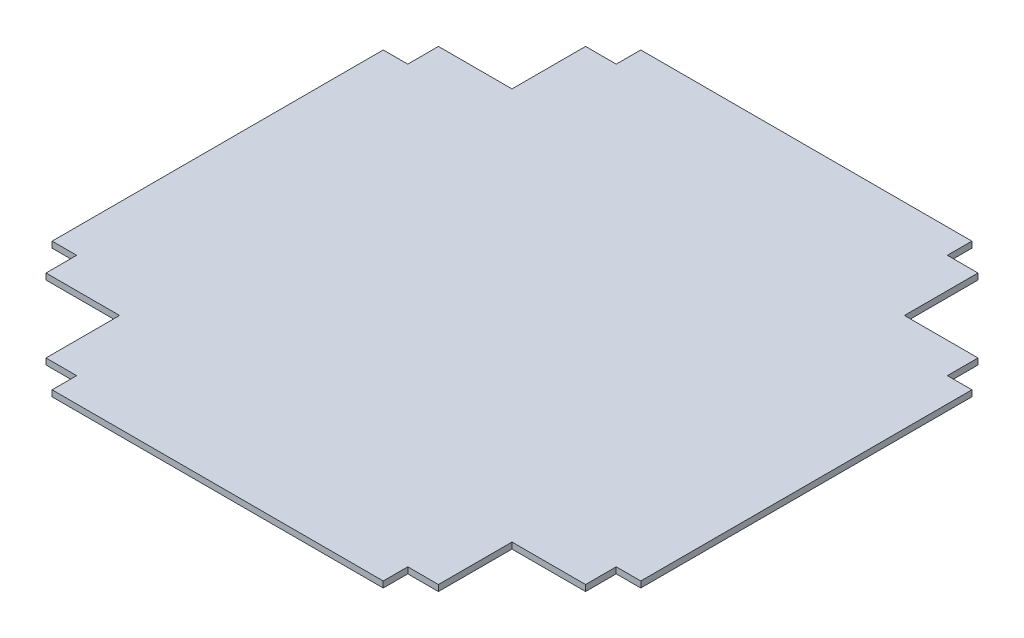
ISO-10303-21;
HEADER;
FILE_DESCRIPTION(('STEP AP214'),'2;1');
FILE_NAME('part.step','',(''),(''),'','','');
FILE_SCHEMA(('AUTOMOTIVE_DESIGN { 1 0 10303 214 1 1 1 1 }'));
ENDSEC;
DATA;
#1=APPLICATION_CONTEXT('core data for automotive mechanical design processes');
#2=APPLICATION_PROTOCOL_DEFINITION('international standard','automotive_design',2000,#1);
#3=PRODUCT_CONTEXT('',#1,'mechanical');
#4=PRODUCT('Part','Part','',(#3));
#5=PRODUCT_RELATED_PRODUCT_CATEGORY('part','',(#4));
#6=PRODUCT_DEFINITION_FORMATION('','',#4);
#7=PRODUCT_DEFINITION_CONTEXT('part definition',#1,'design');
#8=PRODUCT_DEFINITION('design','',#6,#7);
#9=PRODUCT_DEFINITION_SHAPE('','',#8);
#10=(LENGTH_UNIT() NAMED_UNIT(*) SI_UNIT(.MILLI.,.METRE.));
#11=(NAMED_UNIT(*) PLANE_ANGLE_UNIT() SI_UNIT($,.RADIAN.));
#12=(NAMED_UNIT(*) SI_UNIT($,.STERADIAN.) SOLID_ANGLE_UNIT());
#13=UNCERTAINTY_MEASURE_WITH_UNIT(LENGTH_MEASURE(1.E-05),#10,'distance_accuracy_value','');
#14=(GEOMETRIC_REPRESENTATION_CONTEXT(3) GLOBAL_UNCERTAINTY_ASSIGNED_CONTEXT((#13)) GLOBAL_UNIT_ASSIGNED_CONTEXT((#10,
#11,#12)) REPRESENTATION_CONTEXT('',''));
#15=CARTESIAN_POINT('',(0.,0.,0.));
#16=DIRECTION('',(0.,0.,1.));
#17=DIRECTION('',(1.,0.,0.));
#18=AXIS2_PLACEMENT_3D('',#15,#16,#17);
#19=CARTESIAN_POINT('',(0.,6.35,0.));
#20=DIRECTION('',(1.,0.,0.));
#21=DIRECTION('',(0.,0.,-1.));
#22=AXIS2_PLACEMENT_3D('',#19,#20,#21);
#23=PLANE('',#22);
#24=DIRECTION('',(0.,0.,1.));
#25=VECTOR('',#24,1.);
#26=CARTESIAN_POINT('',(0.,6.35,0.));
#27=LINE('',#26,#25);
#28=CARTESIAN_POINT('',(-1.11022302462516E-13,6.35,-476.25));
#29=VERTEX_POINT('',#28);
#30=CARTESIAN_POINT('',(-1.11022302462516E-13,6.35,-133.35));
#31=VERTEX_POINT('',#30);
#32=EDGE_CURVE('E265',#29,#31,#27,.T.);
#33=ORIENTED_EDGE('',*,*,#32,.F.);
#34=DIRECTION('',(0.,1.,0.));
#35=VECTOR('',#34,1.);
#36=CARTESIAN_POINT('',(-1.11022302462516E-13,0.,-476.25));
#37=LINE('',#36,#35);
#38=CARTESIAN_POINT('',(-1.11022302462516E-13,0.,-476.25));
#39=VERTEX_POINT('',#38);
#40=EDGE_CURVE('E248',#39,#29,#37,.T.);
#41=ORIENTED_EDGE('',*,*,#40,.F.);
#42=DIRECTION('',(0.,0.,1.));
#43=VECTOR('',#42,1.);
#44=CARTESIAN_POINT('',(0.,0.,0.));
#45=LINE('',#44,#43);
#46=CARTESIAN_POINT('',(-1.11022302462516E-13,0.,-133.35));
#47=VERTEX_POINT('',#46);
#48=EDGE_CURVE('E241',#39,#47,#45,.T.);
#49=ORIENTED_EDGE('',*,*,#48,.T.);
#50=DIRECTION('',(0.,1.,0.));
#51=VECTOR('',#50,1.);
#52=CARTESIAN_POINT('',(-1.11022302462516E-13,0.,-133.35));
#53=LINE('',#52,#51);
#54=EDGE_CURVE('E222',#47,#31,#53,.T.);
#55=ORIENTED_EDGE('',*,*,#54,.T.);
#56=EDGE_LOOP('',(#33,#41,#49,#55));
#57=FACE_BOUND('',#56,.T.);
#58=ADVANCED_FACE('F36',(#57),#23,.F.);
#59=CARTESIAN_POINT('',(0.,6.35,0.));
#60=DIRECTION('',(0.,0.,-1.));
#61=DIRECTION('',(-1.,0.,0.));
#62=AXIS2_PLACEMENT_3D('',#59,#60,#61);
#63=PLANE('',#62);
#64=DIRECTION('',(1.,0.,0.));
#65=VECTOR('',#64,1.);
#66=CARTESIAN_POINT('',(0.,6.35,0.));
#67=LINE('',#66,#65);
#68=CARTESIAN_POINT('',(133.35,6.35,0.));
#69=VERTEX_POINT('',#68);
#70=CARTESIAN_POINT('',(476.25,6.35,0.));
#71=VERTEX_POINT('',#70);
#72=EDGE_CURVE('E270',#69,#71,#67,.T.);
#73=ORIENTED_EDGE('',*,*,#72,.F.);
#74=DIRECTION('',(0.,1.,0.));
#75=VECTOR('',#74,1.);
#76=CARTESIAN_POINT('',(133.35,0.,0.));
#77=LINE('',#76,#75);
#78=CARTESIAN_POINT('',(133.35,0.,0.));
#79=VERTEX_POINT('',#78);
#80=EDGE_CURVE('E233',#79,#69,#77,.T.);
#81=ORIENTED_EDGE('',*,*,#80,.F.);
#82=DIRECTION('',(1.,0.,0.));
#83=VECTOR('',#82,1.);
#84=CARTESIAN_POINT('',(0.,0.,0.));
#85=LINE('',#84,#83);
#86=CARTESIAN_POINT('',(476.25,0.,0.));
#87=VERTEX_POINT('',#86);
#88=EDGE_CURVE('E249',#79,#87,#85,.T.);
#89=ORIENTED_EDGE('',*,*,#88,.T.);
#90=DIRECTION('',(0.,1.,0.));
#91=VECTOR('',#90,1.);
#92=CARTESIAN_POINT('',(476.25,0.,0.));
#93=LINE('',#92,#91);
#94=EDGE_CURVE('E250',#87,#71,#93,.T.);
#95=ORIENTED_EDGE('',*,*,#94,.T.);
#96=EDGE_LOOP('',(#73,#81,#89,#95));
#97=FACE_BOUND('',#96,.T.);
#98=ADVANCED_FACE('F466',(#97),#63,.F.);
#99=CARTESIAN_POINT('',(609.6,6.35,0.));
#100=DIRECTION('',(-1.,0.,0.));
#101=DIRECTION('',(0.,0.,1.));
#102=AXIS2_PLACEMENT_3D('',#99,#100,#101);
#103=PLANE('',#102);
#104=DIRECTION('',(0.,0.,-1.));
#105=VECTOR('',#104,1.);
#106=CARTESIAN_POINT('',(609.6,0.,0.));
#107=LINE('',#106,#105);
#108=CARTESIAN_POINT('',(609.6,0.,-133.35));
#109=VERTEX_POINT('',#108);
#110=CARTESIAN_POINT('',(609.6,0.,-476.25));
#111=VERTEX_POINT('',#110);
#112=EDGE_CURVE('E253',#109,#111,#107,.T.);
#113=ORIENTED_EDGE('',*,*,#112,.T.);
#114=DIRECTION('',(0.,1.,0.));
#115=VECTOR('',#114,1.);
#116=CARTESIAN_POINT('',(609.6,0.,-476.25));
#117=LINE('',#116,#115);
#118=CARTESIAN_POINT('',(609.6,6.35,-476.25));
#119=VERTEX_POINT('',#118);
#120=EDGE_CURVE('E290',#111,#119,#117,.T.);
#121=ORIENTED_EDGE('',*,*,#120,.T.);
#122=DIRECTION('',(0.,0.,-1.));
#123=VECTOR('',#122,1.);
#124=CARTESIAN_POINT('',(609.6,6.35,0.));
#125=LINE('',#124,#123);
#126=CARTESIAN_POINT('',(609.6,6.35,-133.35));
#127=VERTEX_POINT('',#126);
#128=EDGE_CURVE('E44',#127,#119,#125,.T.);
#129=ORIENTED_EDGE('',*,*,#128,.F.);
#130=DIRECTION('',(0.,1.,0.));
#131=VECTOR('',#130,1.);
#132=CARTESIAN_POINT('',(609.6,0.,-133.35));
#133=LINE('',#132,#131);
#134=EDGE_CURVE('E277',#109,#127,#133,.T.);
#135=ORIENTED_EDGE('',*,*,#134,.F.);
#136=EDGE_LOOP('',(#113,#121,#129,#135));
#137=FACE_BOUND('',#136,.T.);
#138=ADVANCED_FACE('F289',(#137),#103,.F.);
#139=CARTESIAN_POINT('',(0.,6.35,-609.6));
#140=DIRECTION('',(0.,0.,1.));
#141=DIRECTION('',(1.,0.,0.));
#142=AXIS2_PLACEMENT_3D('',#139,#140,#141);
#143=PLANE('',#142);
#144=DIRECTION('',(-1.,0.,0.));
#145=VECTOR('',#144,1.);
#146=CARTESIAN_POINT('',(0.,6.35,-609.6));
#147=LINE('',#146,#145);
#148=CARTESIAN_POINT('',(476.25,6.35,-609.6));
#149=VERTEX_POINT('',#148);
#150=CARTESIAN_POINT('',(133.35,6.35,-609.6));
#151=VERTEX_POINT('',#150);
#152=EDGE_CURVE('E11',#149,#151,#147,.T.);
#153=ORIENTED_EDGE('',*,*,#152,.F.);
#154=DIRECTION('',(0.,1.,0.));
#155=VECTOR('',#154,1.);
#156=CARTESIAN_POINT('',(476.25,0.,-609.6));
#157=LINE('',#156,#155);
#158=CARTESIAN_POINT('',(476.25,0.,-609.6));
#159=VERTEX_POINT('',#158);
#160=EDGE_CURVE('E293',#159,#149,#157,.T.);
#161=ORIENTED_EDGE('',*,*,#160,.F.);
#162=DIRECTION('',(-1.,0.,0.));
#163=VECTOR('',#162,1.);
#164=CARTESIAN_POINT('',(0.,0.,-609.6));
#165=LINE('',#164,#163);
#166=CARTESIAN_POINT('',(133.35,0.,-609.6));
#167=VERTEX_POINT('',#166);
#168=EDGE_CURVE('E39',#159,#167,#165,.T.);
#169=ORIENTED_EDGE('',*,*,#168,.T.);
#170=DIRECTION('',(0.,1.,0.));
#171=VECTOR('',#170,1.);
#172=CARTESIAN_POINT('',(133.35,0.,-609.6));
#173=LINE('',#172,#171);
#174=EDGE_CURVE('E401',#167,#151,#173,.T.);
#175=ORIENTED_EDGE('',*,*,#174,.T.);
#176=EDGE_LOOP('',(#153,#161,#169,#175));
#177=FACE_BOUND('',#176,.T.);
#178=ADVANCED_FACE('F400',(#177),#143,.F.);
#179=CARTESIAN_POINT('',(0.,6.35,0.));
#180=DIRECTION('',(0.,-1.,0.));
#181=DIRECTION('',(0.,0.,-1.));
#182=AXIS2_PLACEMENT_3D('',#179,#180,#181);
#183=PLANE('',#182);
#184=ORIENTED_EDGE('',*,*,#128,.T.);
#185=DIRECTION('',(1.,0.,0.));
#186=VECTOR('',#185,1.);
#187=CARTESIAN_POINT('',(584.2,6.35,-476.25));
#188=LINE('',#187,#186);
#189=CARTESIAN_POINT('',(584.2,6.35,-476.25));
#190=VERTEX_POINT('',#189);
#191=EDGE_CURVE('E285',#190,#119,#188,.T.);
#192=ORIENTED_EDGE('',*,*,#191,.F.);
#193=DIRECTION('',(0.,0.,1.));
#194=VECTOR('',#193,1.);
#195=CARTESIAN_POINT('',(584.2,6.35,-508.));
#196=LINE('',#195,#194);
#197=CARTESIAN_POINT('',(584.2,6.35,-508.));
#198=VERTEX_POINT('',#197);
#199=EDGE_CURVE('E352',#198,#190,#196,.T.);
#200=ORIENTED_EDGE('',*,*,#199,.F.);
#201=DIRECTION('',(1.,0.,0.));
#202=VECTOR('',#201,1.);
#203=CARTESIAN_POINT('',(508.,6.35,-508.));
#204=LINE('',#203,#202);
#205=CARTESIAN_POINT('',(508.,6.35,-508.));
#206=VERTEX_POINT('',#205);
#207=EDGE_CURVE('E357',#206,#198,#204,.T.);
#208=ORIENTED_EDGE('',*,*,#207,.F.);
#209=DIRECTION('',(0.,0.,1.));
#210=VECTOR('',#209,1.);
#211=CARTESIAN_POINT('',(508.,6.35,-584.2));
#212=LINE('',#211,#210);
#213=CARTESIAN_POINT('',(508.,6.35,-584.2));
#214=VERTEX_POINT('',#213);
#215=EDGE_CURVE('E374',#214,#206,#212,.T.);
#216=ORIENTED_EDGE('',*,*,#215,.F.);
#217=DIRECTION('',(1.,0.,0.));
#218=VECTOR('',#217,1.);
#219=CARTESIAN_POINT('',(476.25,6.35,-584.2));
#220=LINE('',#219,#218);
#221=CARTESIAN_POINT('',(476.25,6.35,-584.2));
#222=VERTEX_POINT('',#221);
#223=EDGE_CURVE('E371',#222,#214,#220,.T.);
#224=ORIENTED_EDGE('',*,*,#223,.F.);
#225=DIRECTION('',(0.,0.,1.));
#226=VECTOR('',#225,1.);
#227=CARTESIAN_POINT('',(476.25,6.35,-609.6));
#228=LINE('',#227,#226);
#229=EDGE_CURVE('E368',#149,#222,#228,.T.);
#230=ORIENTED_EDGE('',*,*,#229,.F.);
#231=ORIENTED_EDGE('',*,*,#152,.T.);
#232=DIRECTION('',(0.,0.,-1.));
#233=VECTOR('',#232,1.);
#234=CARTESIAN_POINT('',(133.35,6.35,-609.6));
#235=LINE('',#234,#233);
#236=CARTESIAN_POINT('',(133.35,6.35,-584.2));
#237=VERTEX_POINT('',#236);
#238=EDGE_CURVE('E404',#237,#151,#235,.T.);
#239=ORIENTED_EDGE('',*,*,#238,.F.);
#240=DIRECTION('',(1.,0.,0.));
#241=VECTOR('',#240,1.);
#242=CARTESIAN_POINT('',(133.35,6.35,-584.2));
#243=LINE('',#242,#241);
#244=CARTESIAN_POINT('',(101.6,6.35,-584.2));
#245=VERTEX_POINT('',#244);
#246=EDGE_CURVE('E407',#245,#237,#243,.T.);
#247=ORIENTED_EDGE('',*,*,#246,.F.);
#248=DIRECTION('',(0.,0.,-1.));
#249=VECTOR('',#248,1.);
#250=CARTESIAN_POINT('',(101.6,6.35,-584.2));
#251=LINE('',#250,#249);
#252=CARTESIAN_POINT('',(101.6,6.35,-508.));
#253=VERTEX_POINT('',#252);
#254=EDGE_CURVE('E412',#253,#245,#251,.T.);
#255=ORIENTED_EDGE('',*,*,#254,.F.);
#256=DIRECTION('',(1.,0.,0.));
#257=VECTOR('',#256,1.);
#258=CARTESIAN_POINT('',(101.6,6.35,-508.));
#259=LINE('',#258,#257);
#260=CARTESIAN_POINT('',(25.3999999999999,6.35,-508.));
#261=VERTEX_POINT('',#260);
#262=EDGE_CURVE('E440',#261,#253,#259,.T.);
#263=ORIENTED_EDGE('',*,*,#262,.F.);
#264=DIRECTION('',(0.,0.,-1.));
#265=VECTOR('',#264,1.);
#266=CARTESIAN_POINT('',(25.3999999999999,6.35,-508.));
#267=LINE('',#266,#265);
#268=CARTESIAN_POINT('',(25.3999999999999,6.35,-476.25));
#269=VERTEX_POINT('',#268);
#270=EDGE_CURVE('E438',#269,#261,#267,.T.);
#271=ORIENTED_EDGE('',*,*,#270,.F.);
#272=DIRECTION('',(1.,0.,0.));
#273=VECTOR('',#272,1.);
#274=CARTESIAN_POINT('',(25.3999999999999,6.35,-476.25));
#275=LINE('',#274,#273);
#276=EDGE_CURVE('E381',#29,#269,#275,.T.);
#277=ORIENTED_EDGE('',*,*,#276,.F.);
#278=ORIENTED_EDGE('',*,*,#32,.T.);
#279=DIRECTION('',(-1.,0.,0.));
#280=VECTOR('',#279,1.);
#281=CARTESIAN_POINT('',(25.3999999999999,6.35,-133.35));
#282=LINE('',#281,#280);
#283=CARTESIAN_POINT('',(25.3999999999999,6.35,-133.35));
#284=VERTEX_POINT('',#283);
#285=EDGE_CURVE('E228',#284,#31,#282,.T.);
#286=ORIENTED_EDGE('',*,*,#285,.F.);
#287=DIRECTION('',(0.,0.,-1.));
#288=VECTOR('',#287,1.);
#289=CARTESIAN_POINT('',(25.4,6.35,-101.6));
#290=LINE('',#289,#288);
#291=CARTESIAN_POINT('',(25.4,6.35,-101.6));
#292=VERTEX_POINT('',#291);
#293=EDGE_CURVE('E245',#292,#284,#290,.T.);
#294=ORIENTED_EDGE('',*,*,#293,.F.);
#295=DIRECTION('',(-1.,0.,0.));
#296=VECTOR('',#295,1.);
#297=CARTESIAN_POINT('',(101.6,6.35,-101.6));
#298=LINE('',#297,#296);
#299=CARTESIAN_POINT('',(101.6,6.35,-101.6));
#300=VERTEX_POINT('',#299);
#301=EDGE_CURVE('E728',#300,#292,#298,.T.);
#302=ORIENTED_EDGE('',*,*,#301,.F.);
#303=DIRECTION('',(0.,0.,-1.));
#304=VECTOR('',#303,1.);
#305=CARTESIAN_POINT('',(101.6,6.35,-25.3999999999999));
#306=LINE('',#305,#304);
#307=CARTESIAN_POINT('',(101.6,6.35,-25.3999999999999));
#308=VERTEX_POINT('',#307);
#309=EDGE_CURVE('E740',#308,#300,#306,.T.);
#310=ORIENTED_EDGE('',*,*,#309,.F.);
#311=DIRECTION('',(-1.,0.,0.));
#312=VECTOR('',#311,1.);
#313=CARTESIAN_POINT('',(133.35,6.35,-25.3999999999999));
#314=LINE('',#313,#312);
#315=CARTESIAN_POINT('',(133.35,6.35,-25.3999999999999));
#316=VERTEX_POINT('',#315);
#317=EDGE_CURVE('E733',#316,#308,#314,.T.);
#318=ORIENTED_EDGE('',*,*,#317,.F.);
#319=DIRECTION('',(0.,0.,-1.));
#320=VECTOR('',#319,1.);
#321=CARTESIAN_POINT('',(133.35,6.35,0.));
#322=LINE('',#321,#320);
#323=EDGE_CURVE('E730',#69,#316,#322,.T.);
#324=ORIENTED_EDGE('',*,*,#323,.F.);
#325=ORIENTED_EDGE('',*,*,#72,.T.);
#326=DIRECTION('',(0.,0.,1.));
#327=VECTOR('',#326,1.);
#328=CARTESIAN_POINT('',(476.25,6.35,0.));
#329=LINE('',#328,#327);
#330=CARTESIAN_POINT('',(476.25,6.35,-25.4));
#331=VERTEX_POINT('',#330);
#332=EDGE_CURVE('E307',#331,#71,#329,.T.);
#333=ORIENTED_EDGE('',*,*,#332,.F.);
#334=DIRECTION('',(-1.,0.,0.));
#335=VECTOR('',#334,1.);
#336=CARTESIAN_POINT('',(476.25,6.35,-25.4));
#337=LINE('',#336,#335);
#338=CARTESIAN_POINT('',(508.,6.35,-25.4));
#339=VERTEX_POINT('',#338);
#340=EDGE_CURVE('E333',#339,#331,#337,.T.);
#341=ORIENTED_EDGE('',*,*,#340,.F.);
#342=DIRECTION('',(0.,0.,1.));
#343=VECTOR('',#342,1.);
#344=CARTESIAN_POINT('',(508.,6.35,-25.4));
#345=LINE('',#344,#343);
#346=CARTESIAN_POINT('',(508.,6.35,-101.6));
#347=VERTEX_POINT('',#346);
#348=EDGE_CURVE('E330',#347,#339,#345,.T.);
#349=ORIENTED_EDGE('',*,*,#348,.F.);
#350=DIRECTION('',(-1.,0.,0.));
#351=VECTOR('',#350,1.);
#352=CARTESIAN_POINT('',(508.,6.35,-101.6));
#353=LINE('',#352,#351);
#354=CARTESIAN_POINT('',(584.2,6.35,-101.6));
#355=VERTEX_POINT('',#354);
#356=EDGE_CURVE('E327',#355,#347,#353,.T.);
#357=ORIENTED_EDGE('',*,*,#356,.F.);
#358=DIRECTION('',(0.,0.,1.));
#359=VECTOR('',#358,1.);
#360=CARTESIAN_POINT('',(584.2,6.35,-101.6));
#361=LINE('',#360,#359);
#362=CARTESIAN_POINT('',(584.2,6.35,-133.35));
#363=VERTEX_POINT('',#362);
#364=EDGE_CURVE('E323',#363,#355,#361,.T.);
#365=ORIENTED_EDGE('',*,*,#364,.F.);
#366=DIRECTION('',(-1.,0.,0.));
#367=VECTOR('',#366,1.);
#368=CARTESIAN_POINT('',(584.2,6.35,-133.35));
#369=LINE('',#368,#367);
#370=EDGE_CURVE('E288',#127,#363,#369,.T.);
#371=ORIENTED_EDGE('',*,*,#370,.F.);
#372=EDGE_LOOP('',(#184,#192,#200,#208,#216,#224,#230,#231,#239,#247,#255,#263,#271,#277,#278,
#286,#294,#302,#310,#318,#324,#325,#333,#341,#349,#357,#365,#371));
#373=FACE_BOUND('',#372,.T.);
#374=ADVANCED_FACE('F283',(#373),#183,.F.);
#375=CARTESIAN_POINT('',(0.,0.,0.));
#376=DIRECTION('',(0.,-1.,0.));
#377=DIRECTION('',(0.,0.,-1.));
#378=AXIS2_PLACEMENT_3D('',#375,#376,#377);
#379=PLANE('',#378);
#380=DIRECTION('',(1.,0.,0.));
#381=VECTOR('',#380,1.);
#382=CARTESIAN_POINT('',(584.2,0.,-476.25));
#383=LINE('',#382,#381);
#384=CARTESIAN_POINT('',(584.2,0.,-476.25));
#385=VERTEX_POINT('',#384);
#386=EDGE_CURVE('E348',#385,#111,#383,.T.);
#387=ORIENTED_EDGE('',*,*,#386,.T.);
#388=ORIENTED_EDGE('',*,*,#112,.F.);
#389=DIRECTION('',(-1.,0.,0.));
#390=VECTOR('',#389,1.);
#391=CARTESIAN_POINT('',(584.2,0.,-133.35));
#392=LINE('',#391,#390);
#393=CARTESIAN_POINT('',(584.2,0.,-133.35));
#394=VERTEX_POINT('',#393);
#395=EDGE_CURVE('E303',#109,#394,#392,.T.);
#396=ORIENTED_EDGE('',*,*,#395,.T.);
#397=DIRECTION('',(0.,0.,1.));
#398=VECTOR('',#397,1.);
#399=CARTESIAN_POINT('',(584.2,0.,-101.6));
#400=LINE('',#399,#398);
#401=CARTESIAN_POINT('',(584.2,0.,-101.6));
#402=VERTEX_POINT('',#401);
#403=EDGE_CURVE('E306',#394,#402,#400,.T.);
#404=ORIENTED_EDGE('',*,*,#403,.T.);
#405=DIRECTION('',(-1.,0.,0.));
#406=VECTOR('',#405,1.);
#407=CARTESIAN_POINT('',(508.,0.,-101.6));
#408=LINE('',#407,#406);
#409=CARTESIAN_POINT('',(508.,0.,-101.6));
#410=VERTEX_POINT('',#409);
#411=EDGE_CURVE('E310',#402,#410,#408,.T.);
#412=ORIENTED_EDGE('',*,*,#411,.T.);
#413=DIRECTION('',(0.,0.,1.));
#414=VECTOR('',#413,1.);
#415=CARTESIAN_POINT('',(508.,0.,-25.4));
#416=LINE('',#415,#414);
#417=CARTESIAN_POINT('',(508.,0.,-25.4));
#418=VERTEX_POINT('',#417);
#419=EDGE_CURVE('E313',#410,#418,#416,.T.);
#420=ORIENTED_EDGE('',*,*,#419,.T.);
#421=DIRECTION('',(-1.,0.,0.));
#422=VECTOR('',#421,1.);
#423=CARTESIAN_POINT('',(476.25,0.,-25.4));
#424=LINE('',#423,#422);
#425=CARTESIAN_POINT('',(476.25,0.,-25.4));
#426=VERTEX_POINT('',#425);
#427=EDGE_CURVE('E316',#418,#426,#424,.T.);
#428=ORIENTED_EDGE('',*,*,#427,.T.);
#429=DIRECTION('',(0.,0.,1.));
#430=VECTOR('',#429,1.);
#431=CARTESIAN_POINT('',(476.25,0.,0.));
#432=LINE('',#431,#430);
#433=EDGE_CURVE('E319',#426,#87,#432,.T.);
#434=ORIENTED_EDGE('',*,*,#433,.T.);
#435=ORIENTED_EDGE('',*,*,#88,.F.);
#436=DIRECTION('',(0.,0.,-1.));
#437=VECTOR('',#436,1.);
#438=CARTESIAN_POINT('',(133.35,0.,0.));
#439=LINE('',#438,#437);
#440=CARTESIAN_POINT('',(133.35,0.,-25.3999999999999));
#441=VERTEX_POINT('',#440);
#442=EDGE_CURVE('E244',#79,#441,#439,.T.);
#443=ORIENTED_EDGE('',*,*,#442,.T.);
#444=DIRECTION('',(-1.,0.,0.));
#445=VECTOR('',#444,1.);
#446=CARTESIAN_POINT('',(133.35,0.,-25.3999999999999));
#447=LINE('',#446,#445);
#448=CARTESIAN_POINT('',(101.6,0.,-25.3999999999999));
#449=VERTEX_POINT('',#448);
#450=EDGE_CURVE('E772',#441,#449,#447,.T.);
#451=ORIENTED_EDGE('',*,*,#450,.T.);
#452=DIRECTION('',(0.,0.,-1.));
#453=VECTOR('',#452,1.);
#454=CARTESIAN_POINT('',(101.6,0.,-25.3999999999999));
#455=LINE('',#454,#453);
#456=CARTESIAN_POINT('',(101.6,0.,-101.6));
#457=VERTEX_POINT('',#456);
#458=EDGE_CURVE('E774',#449,#457,#455,.T.);
#459=ORIENTED_EDGE('',*,*,#458,.T.);
#460=DIRECTION('',(-1.,0.,0.));
#461=VECTOR('',#460,1.);
#462=CARTESIAN_POINT('',(101.6,0.,-101.6));
#463=LINE('',#462,#461);
#464=CARTESIAN_POINT('',(25.4,0.,-101.6));
#465=VERTEX_POINT('',#464);
#466=EDGE_CURVE('E777',#457,#465,#463,.T.);
#467=ORIENTED_EDGE('',*,*,#466,.T.);
#468=DIRECTION('',(0.,0.,-1.));
#469=VECTOR('',#468,1.);
#470=CARTESIAN_POINT('',(25.4,0.,-101.6));
#471=LINE('',#470,#469);
#472=CARTESIAN_POINT('',(25.3999999999999,0.,-133.35));
#473=VERTEX_POINT('',#472);
#474=EDGE_CURVE('E234',#465,#473,#471,.T.);
#475=ORIENTED_EDGE('',*,*,#474,.T.);
#476=DIRECTION('',(-1.,0.,0.));
#477=VECTOR('',#476,1.);
#478=CARTESIAN_POINT('',(25.3999999999999,0.,-133.35));
#479=LINE('',#478,#477);
#480=EDGE_CURVE('E225',#473,#47,#479,.T.);
#481=ORIENTED_EDGE('',*,*,#480,.T.);
#482=ORIENTED_EDGE('',*,*,#48,.F.);
#483=DIRECTION('',(1.,0.,0.));
#484=VECTOR('',#483,1.);
#485=CARTESIAN_POINT('',(25.3999999999999,0.,-476.25));
#486=LINE('',#485,#484);
#487=CARTESIAN_POINT('',(25.3999999999999,0.,-476.25));
#488=VERTEX_POINT('',#487);
#489=EDGE_CURVE('E409',#39,#488,#486,.T.);
#490=ORIENTED_EDGE('',*,*,#489,.T.);
#491=DIRECTION('',(0.,0.,-1.));
#492=VECTOR('',#491,1.);
#493=CARTESIAN_POINT('',(25.3999999999999,0.,-508.));
#494=LINE('',#493,#492);
#495=CARTESIAN_POINT('',(25.3999999999999,0.,-508.));
#496=VERTEX_POINT('',#495);
#497=EDGE_CURVE('E60',#488,#496,#494,.T.);
#498=ORIENTED_EDGE('',*,*,#497,.T.);
#499=DIRECTION('',(1.,0.,0.));
#500=VECTOR('',#499,1.);
#501=CARTESIAN_POINT('',(101.6,0.,-508.));
#502=LINE('',#501,#500);
#503=CARTESIAN_POINT('',(101.6,0.,-508.));
#504=VERTEX_POINT('',#503);
#505=EDGE_CURVE('E453',#496,#504,#502,.T.);
#506=ORIENTED_EDGE('',*,*,#505,.T.);
#507=DIRECTION('',(0.,0.,-1.));
#508=VECTOR('',#507,1.);
#509=CARTESIAN_POINT('',(101.6,0.,-584.2));
#510=LINE('',#509,#508);
#511=CARTESIAN_POINT('',(101.6,0.,-584.2));
#512=VERTEX_POINT('',#511);
#513=EDGE_CURVE('E433',#504,#512,#510,.T.);
#514=ORIENTED_EDGE('',*,*,#513,.T.);
#515=DIRECTION('',(1.,0.,0.));
#516=VECTOR('',#515,1.);
#517=CARTESIAN_POINT('',(133.35,0.,-584.2));
#518=LINE('',#517,#516);
#519=CARTESIAN_POINT('',(133.35,0.,-584.2));
#520=VERTEX_POINT('',#519);
#521=EDGE_CURVE('E429',#512,#520,#518,.T.);
#522=ORIENTED_EDGE('',*,*,#521,.T.);
#523=DIRECTION('',(0.,0.,-1.));
#524=VECTOR('',#523,1.);
#525=CARTESIAN_POINT('',(133.35,0.,-609.6));
#526=LINE('',#525,#524);
#527=EDGE_CURVE('E427',#520,#167,#526,.T.);
#528=ORIENTED_EDGE('',*,*,#527,.T.);
#529=ORIENTED_EDGE('',*,*,#168,.F.);
#530=DIRECTION('',(0.,0.,1.));
#531=VECTOR('',#530,1.);
#532=CARTESIAN_POINT('',(476.25,0.,-609.6));
#533=LINE('',#532,#531);
#534=CARTESIAN_POINT('',(476.25,0.,-584.2));
#535=VERTEX_POINT('',#534);
#536=EDGE_CURVE('E351',#159,#535,#533,.T.);
#537=ORIENTED_EDGE('',*,*,#536,.T.);
#538=DIRECTION('',(1.,0.,0.));
#539=VECTOR('',#538,1.);
#540=CARTESIAN_POINT('',(476.25,0.,-584.2));
#541=LINE('',#540,#539);
#542=CARTESIAN_POINT('',(508.,0.,-584.2));
#543=VERTEX_POINT('',#542);
#544=EDGE_CURVE('E52',#535,#543,#541,.T.);
#545=ORIENTED_EDGE('',*,*,#544,.T.);
#546=DIRECTION('',(0.,0.,1.));
#547=VECTOR('',#546,1.);
#548=CARTESIAN_POINT('',(508.,0.,-584.2));
#549=LINE('',#548,#547);
#550=CARTESIAN_POINT('',(508.,0.,-508.));
#551=VERTEX_POINT('',#550);
#552=EDGE_CURVE('E363',#543,#551,#549,.T.);
#553=ORIENTED_EDGE('',*,*,#552,.T.);
#554=DIRECTION('',(1.,0.,0.));
#555=VECTOR('',#554,1.);
#556=CARTESIAN_POINT('',(508.,0.,-508.));
#557=LINE('',#556,#555);
#558=CARTESIAN_POINT('',(584.2,0.,-508.));
#559=VERTEX_POINT('',#558);
#560=EDGE_CURVE('E299',#551,#559,#557,.T.);
#561=ORIENTED_EDGE('',*,*,#560,.T.);
#562=DIRECTION('',(0.,0.,1.));
#563=VECTOR('',#562,1.);
#564=CARTESIAN_POINT('',(584.2,0.,-508.));
#565=LINE('',#564,#563);
#566=EDGE_CURVE('E294',#559,#385,#565,.T.);
#567=ORIENTED_EDGE('',*,*,#566,.T.);
#568=EDGE_LOOP('',(#387,#388,#396,#404,#412,#420,#428,#434,#435,#443,#451,#459,#467,#475,#481,
#482,#490,#498,#506,#514,#522,#528,#529,#537,#545,#553,#561,#567));
#569=FACE_BOUND('',#568,.T.);
#570=ADVANCED_FACE('F239',(#569),#379,.T.);
#571=CARTESIAN_POINT('',(476.25,0.,0.));
#572=DIRECTION('',(-1.,0.,0.));
#573=DIRECTION('',(0.,0.,1.));
#574=AXIS2_PLACEMENT_3D('',#571,#572,#573);
#575=PLANE('',#574);
#576=ORIENTED_EDGE('',*,*,#332,.T.);
#577=ORIENTED_EDGE('',*,*,#94,.F.);
#578=ORIENTED_EDGE('',*,*,#433,.F.);
#579=DIRECTION('',(0.,1.,0.));
#580=VECTOR('',#579,1.);
#581=CARTESIAN_POINT('',(476.25,0.,-25.4));
#582=LINE('',#581,#580);
#583=EDGE_CURVE('E256',#426,#331,#582,.T.);
#584=ORIENTED_EDGE('',*,*,#583,.T.);
#585=EDGE_LOOP('',(#576,#577,#578,#584));
#586=FACE_BOUND('',#585,.T.);
#587=ADVANCED_FACE('F481',(#586),#575,.F.);
#588=CARTESIAN_POINT('',(476.25,0.,-25.4));
#589=DIRECTION('',(0.,0.,-1.));
#590=DIRECTION('',(-1.,0.,0.));
#591=AXIS2_PLACEMENT_3D('',#588,#589,#590);
#592=PLANE('',#591);
#593=ORIENTED_EDGE('',*,*,#340,.T.);
#594=ORIENTED_EDGE('',*,*,#583,.F.);
#595=ORIENTED_EDGE('',*,*,#427,.F.);
#596=DIRECTION('',(0.,1.,0.));
#597=VECTOR('',#596,1.);
#598=CARTESIAN_POINT('',(508.,0.,-25.4));
#599=LINE('',#598,#597);
#600=EDGE_CURVE('E338',#418,#339,#599,.T.);
#601=ORIENTED_EDGE('',*,*,#600,.T.);
#602=EDGE_LOOP('',(#593,#594,#595,#601));
#603=FACE_BOUND('',#602,.T.);
#604=ADVANCED_FACE('F496',(#603),#592,.F.);
#605=CARTESIAN_POINT('',(508.,0.,-25.4));
#606=DIRECTION('',(-1.,0.,0.));
#607=DIRECTION('',(0.,0.,1.));
#608=AXIS2_PLACEMENT_3D('',#605,#606,#607);
#609=PLANE('',#608);
#610=ORIENTED_EDGE('',*,*,#348,.T.);
#611=ORIENTED_EDGE('',*,*,#600,.F.);
#612=ORIENTED_EDGE('',*,*,#419,.F.);
#613=DIRECTION('',(0.,1.,0.));
#614=VECTOR('',#613,1.);
#615=CARTESIAN_POINT('',(508.,0.,-101.6));
#616=LINE('',#615,#614);
#617=EDGE_CURVE('E340',#410,#347,#616,.T.);
#618=ORIENTED_EDGE('',*,*,#617,.T.);
#619=EDGE_LOOP('',(#610,#611,#612,#618));
#620=FACE_BOUND('',#619,.T.);
#621=ADVANCED_FACE('F492',(#620),#609,.F.);
#622=CARTESIAN_POINT('',(508.,0.,-101.6));
#623=DIRECTION('',(0.,0.,-1.));
#624=DIRECTION('',(-1.,0.,0.));
#625=AXIS2_PLACEMENT_3D('',#622,#623,#624);
#626=PLANE('',#625);
#627=ORIENTED_EDGE('',*,*,#356,.T.);
#628=ORIENTED_EDGE('',*,*,#617,.F.);
#629=ORIENTED_EDGE('',*,*,#411,.F.);
#630=DIRECTION('',(0.,1.,0.));
#631=VECTOR('',#630,1.);
#632=CARTESIAN_POINT('',(584.2,0.,-101.6));
#633=LINE('',#632,#631);
#634=EDGE_CURVE('E342',#402,#355,#633,.T.);
#635=ORIENTED_EDGE('',*,*,#634,.T.);
#636=EDGE_LOOP('',(#627,#628,#629,#635));
#637=FACE_BOUND('',#636,.T.);
#638=ADVANCED_FACE('F489',(#637),#626,.F.);
#639=CARTESIAN_POINT('',(584.2,0.,-101.6));
#640=DIRECTION('',(-1.,0.,0.));
#641=DIRECTION('',(0.,0.,1.));
#642=AXIS2_PLACEMENT_3D('',#639,#640,#641);
#643=PLANE('',#642);
#644=ORIENTED_EDGE('',*,*,#364,.T.);
#645=ORIENTED_EDGE('',*,*,#634,.F.);
#646=ORIENTED_EDGE('',*,*,#403,.F.);
#647=DIRECTION('',(0.,1.,0.));
#648=VECTOR('',#647,1.);
#649=CARTESIAN_POINT('',(584.2,0.,-133.35));
#650=LINE('',#649,#648);
#651=EDGE_CURVE('E343',#394,#363,#650,.T.);
#652=ORIENTED_EDGE('',*,*,#651,.T.);
#653=EDGE_LOOP('',(#644,#645,#646,#652));
#654=FACE_BOUND('',#653,.T.);
#655=ADVANCED_FACE('F486',(#654),#643,.F.);
#656=CARTESIAN_POINT('',(584.2,0.,-133.35));
#657=DIRECTION('',(0.,0.,-1.));
#658=DIRECTION('',(-1.,0.,0.));
#659=AXIS2_PLACEMENT_3D('',#656,#657,#658);
#660=PLANE('',#659);
#661=ORIENTED_EDGE('',*,*,#370,.T.);
#662=ORIENTED_EDGE('',*,*,#651,.F.);
#663=ORIENTED_EDGE('',*,*,#395,.F.);
#664=ORIENTED_EDGE('',*,*,#134,.T.);
#665=EDGE_LOOP('',(#661,#662,#663,#664));
#666=FACE_BOUND('',#665,.T.);
#667=ADVANCED_FACE('F347',(#666),#660,.F.);
#668=CARTESIAN_POINT('',(25.3999999999999,0.,-133.35));
#669=DIRECTION('',(0.,0.,-1.));
#670=DIRECTION('',(-1.,0.,0.));
#671=AXIS2_PLACEMENT_3D('',#668,#669,#670);
#672=PLANE('',#671);
#673=ORIENTED_EDGE('',*,*,#285,.T.);
#674=ORIENTED_EDGE('',*,*,#54,.F.);
#675=ORIENTED_EDGE('',*,*,#480,.F.);
#676=DIRECTION('',(0.,1.,0.));
#677=VECTOR('',#676,1.);
#678=CARTESIAN_POINT('',(25.3999999999999,0.,-133.35));
#679=LINE('',#678,#677);
#680=EDGE_CURVE('E324',#473,#284,#679,.T.);
#681=ORIENTED_EDGE('',*,*,#680,.T.);
#682=EDGE_LOOP('',(#673,#674,#675,#681));
#683=FACE_BOUND('',#682,.T.);
#684=ADVANCED_FACE('F224',(#683),#672,.F.);
#685=CARTESIAN_POINT('',(25.4,0.,-101.6));
#686=DIRECTION('',(1.,0.,0.));
#687=DIRECTION('',(0.,0.,-1.));
#688=AXIS2_PLACEMENT_3D('',#685,#686,#687);
#689=PLANE('',#688);
#690=ORIENTED_EDGE('',*,*,#293,.T.);
#691=ORIENTED_EDGE('',*,*,#680,.F.);
#692=ORIENTED_EDGE('',*,*,#474,.F.);
#693=DIRECTION('',(0.,1.,0.));
#694=VECTOR('',#693,1.);
#695=CARTESIAN_POINT('',(25.4,0.,-101.6));
#696=LINE('',#695,#694);
#697=EDGE_CURVE('E725',#465,#292,#696,.T.);
#698=ORIENTED_EDGE('',*,*,#697,.T.);
#699=EDGE_LOOP('',(#690,#691,#692,#698));
#700=FACE_BOUND('',#699,.T.);
#701=ADVANCED_FACE('F627',(#700),#689,.F.);
#702=CARTESIAN_POINT('',(101.6,0.,-101.6));
#703=DIRECTION('',(0.,0.,-1.));
#704=DIRECTION('',(-1.,0.,0.));
#705=AXIS2_PLACEMENT_3D('',#702,#703,#704);
#706=PLANE('',#705);
#707=ORIENTED_EDGE('',*,*,#301,.T.);
#708=ORIENTED_EDGE('',*,*,#697,.F.);
#709=ORIENTED_EDGE('',*,*,#466,.F.);
#710=DIRECTION('',(0.,1.,0.));
#711=VECTOR('',#710,1.);
#712=CARTESIAN_POINT('',(101.6,0.,-101.6));
#713=LINE('',#712,#711);
#714=EDGE_CURVE('E746',#457,#300,#713,.T.);
#715=ORIENTED_EDGE('',*,*,#714,.T.);
#716=EDGE_LOOP('',(#707,#708,#709,#715));
#717=FACE_BOUND('',#716,.T.);
#718=ADVANCED_FACE('F618',(#717),#706,.F.);
#719=CARTESIAN_POINT('',(101.6,0.,-25.3999999999999));
#720=DIRECTION('',(1.,0.,0.));
#721=DIRECTION('',(0.,0.,-1.));
#722=AXIS2_PLACEMENT_3D('',#719,#720,#721);
#723=PLANE('',#722);
#724=ORIENTED_EDGE('',*,*,#309,.T.);
#725=ORIENTED_EDGE('',*,*,#714,.F.);
#726=ORIENTED_EDGE('',*,*,#458,.F.);
#727=DIRECTION('',(0.,1.,0.));
#728=VECTOR('',#727,1.);
#729=CARTESIAN_POINT('',(101.6,0.,-25.3999999999999));
#730=LINE('',#729,#728);
#731=EDGE_CURVE('E748',#449,#308,#730,.T.);
#732=ORIENTED_EDGE('',*,*,#731,.T.);
#733=EDGE_LOOP('',(#724,#725,#726,#732));
#734=FACE_BOUND('',#733,.T.);
#735=ADVANCED_FACE('F609',(#734),#723,.F.);
#736=CARTESIAN_POINT('',(133.35,0.,-25.3999999999999));
#737=DIRECTION('',(0.,0.,-1.));
#738=DIRECTION('',(-1.,0.,0.));
#739=AXIS2_PLACEMENT_3D('',#736,#737,#738);
#740=PLANE('',#739);
#741=ORIENTED_EDGE('',*,*,#317,.T.);
#742=ORIENTED_EDGE('',*,*,#731,.F.);
#743=ORIENTED_EDGE('',*,*,#450,.F.);
#744=DIRECTION('',(0.,1.,0.));
#745=VECTOR('',#744,1.);
#746=CARTESIAN_POINT('',(133.35,0.,-25.3999999999999));
#747=LINE('',#746,#745);
#748=EDGE_CURVE('E750',#441,#316,#747,.T.);
#749=ORIENTED_EDGE('',*,*,#748,.T.);
#750=EDGE_LOOP('',(#741,#742,#743,#749));
#751=FACE_BOUND('',#750,.T.);
#752=ADVANCED_FACE('F600',(#751),#740,.F.);
#753=CARTESIAN_POINT('',(133.35,0.,0.));
#754=DIRECTION('',(1.,0.,0.));
#755=DIRECTION('',(0.,0.,-1.));
#756=AXIS2_PLACEMENT_3D('',#753,#754,#755);
#757=PLANE('',#756);
#758=ORIENTED_EDGE('',*,*,#323,.T.);
#759=ORIENTED_EDGE('',*,*,#748,.F.);
#760=ORIENTED_EDGE('',*,*,#442,.F.);
#761=ORIENTED_EDGE('',*,*,#80,.T.);
#762=EDGE_LOOP('',(#758,#759,#760,#761));
#763=FACE_BOUND('',#762,.T.);
#764=ADVANCED_FACE('F592',(#763),#757,.F.);
#765=CARTESIAN_POINT('',(133.35,0.,-609.6));
#766=DIRECTION('',(1.,0.,0.));
#767=DIRECTION('',(0.,0.,-1.));
#768=AXIS2_PLACEMENT_3D('',#765,#766,#767);
#769=PLANE('',#768);
#770=ORIENTED_EDGE('',*,*,#238,.T.);
#771=ORIENTED_EDGE('',*,*,#174,.F.);
#772=ORIENTED_EDGE('',*,*,#527,.F.);
#773=DIRECTION('',(0.,1.,0.));
#774=VECTOR('',#773,1.);
#775=CARTESIAN_POINT('',(133.35,0.,-584.2));
#776=LINE('',#775,#774);
#777=EDGE_CURVE('E417',#520,#237,#776,.T.);
#778=ORIENTED_EDGE('',*,*,#777,.T.);
#779=EDGE_LOOP('',(#770,#771,#772,#778));
#780=FACE_BOUND('',#779,.T.);
#781=ADVANCED_FACE('F583',(#780),#769,.F.);
#782=CARTESIAN_POINT('',(133.35,0.,-584.2));
#783=DIRECTION('',(0.,0.,1.));
#784=DIRECTION('',(1.,0.,0.));
#785=AXIS2_PLACEMENT_3D('',#782,#783,#784);
#786=PLANE('',#785);
#787=ORIENTED_EDGE('',*,*,#246,.T.);
#788=ORIENTED_EDGE('',*,*,#777,.F.);
#789=ORIENTED_EDGE('',*,*,#521,.F.);
#790=DIRECTION('',(0.,1.,0.));
#791=VECTOR('',#790,1.);
#792=CARTESIAN_POINT('',(101.6,0.,-584.2));
#793=LINE('',#792,#791);
#794=EDGE_CURVE('E419',#512,#245,#793,.T.);
#795=ORIENTED_EDGE('',*,*,#794,.T.);
#796=EDGE_LOOP('',(#787,#788,#789,#795));
#797=FACE_BOUND('',#796,.T.);
#798=ADVANCED_FACE('F575',(#797),#786,.F.);
#799=CARTESIAN_POINT('',(101.6,0.,-584.2));
#800=DIRECTION('',(1.,0.,0.));
#801=DIRECTION('',(0.,0.,-1.));
#802=AXIS2_PLACEMENT_3D('',#799,#800,#801);
#803=PLANE('',#802);
#804=ORIENTED_EDGE('',*,*,#254,.T.);
#805=ORIENTED_EDGE('',*,*,#794,.F.);
#806=ORIENTED_EDGE('',*,*,#513,.F.);
#807=DIRECTION('',(0.,1.,0.));
#808=VECTOR('',#807,1.);
#809=CARTESIAN_POINT('',(101.6,0.,-508.));
#810=LINE('',#809,#808);
#811=EDGE_CURVE('E421',#504,#253,#810,.T.);
#812=ORIENTED_EDGE('',*,*,#811,.T.);
#813=EDGE_LOOP('',(#804,#805,#806,#812));
#814=FACE_BOUND('',#813,.T.);
#815=ADVANCED_FACE('F444',(#814),#803,.F.);
#816=CARTESIAN_POINT('',(101.6,0.,-508.));
#817=DIRECTION('',(0.,0.,1.));
#818=DIRECTION('',(1.,0.,0.));
#819=AXIS2_PLACEMENT_3D('',#816,#817,#818);
#820=PLANE('',#819);
#821=ORIENTED_EDGE('',*,*,#262,.T.);
#822=ORIENTED_EDGE('',*,*,#811,.F.);
#823=ORIENTED_EDGE('',*,*,#505,.F.);
#824=DIRECTION('',(0.,1.,0.));
#825=VECTOR('',#824,1.);
#826=CARTESIAN_POINT('',(25.3999999999999,0.,-508.));
#827=LINE('',#826,#825);
#828=EDGE_CURVE('E423',#496,#261,#827,.T.);
#829=ORIENTED_EDGE('',*,*,#828,.T.);
#830=EDGE_LOOP('',(#821,#822,#823,#829));
#831=FACE_BOUND('',#830,.T.);
#832=ADVANCED_FACE('F450',(#831),#820,.F.);
#833=CARTESIAN_POINT('',(25.3999999999999,0.,-508.));
#834=DIRECTION('',(1.,0.,0.));
#835=DIRECTION('',(0.,0.,-1.));
#836=AXIS2_PLACEMENT_3D('',#833,#834,#835);
#837=PLANE('',#836);
#838=ORIENTED_EDGE('',*,*,#270,.T.);
#839=ORIENTED_EDGE('',*,*,#828,.F.);
#840=ORIENTED_EDGE('',*,*,#497,.F.);
#841=DIRECTION('',(0.,1.,0.));
#842=VECTOR('',#841,1.);
#843=CARTESIAN_POINT('',(25.3999999999999,0.,-476.25));
#844=LINE('',#843,#842);
#845=EDGE_CURVE('E424',#488,#269,#844,.T.);
#846=ORIENTED_EDGE('',*,*,#845,.T.);
#847=EDGE_LOOP('',(#838,#839,#840,#846));
#848=FACE_BOUND('',#847,.T.);
#849=ADVANCED_FACE('F454',(#848),#837,.F.);
#850=CARTESIAN_POINT('',(25.3999999999999,0.,-476.25));
#851=DIRECTION('',(0.,0.,1.));
#852=DIRECTION('',(1.,0.,0.));
#853=AXIS2_PLACEMENT_3D('',#850,#851,#852);
#854=PLANE('',#853);
#855=ORIENTED_EDGE('',*,*,#276,.T.);
#856=ORIENTED_EDGE('',*,*,#845,.F.);
#857=ORIENTED_EDGE('',*,*,#489,.F.);
#858=ORIENTED_EDGE('',*,*,#40,.T.);
#859=EDGE_LOOP('',(#855,#856,#857,#858));
#860=FACE_BOUND('',#859,.T.);
#861=ADVANCED_FACE('F456',(#860),#854,.F.);
#862=CARTESIAN_POINT('',(584.2,0.,-476.25));
#863=DIRECTION('',(0.,0.,1.));
#864=DIRECTION('',(1.,0.,0.));
#865=AXIS2_PLACEMENT_3D('',#862,#863,#864);
#866=PLANE('',#865);
#867=ORIENTED_EDGE('',*,*,#191,.T.);
#868=ORIENTED_EDGE('',*,*,#120,.F.);
#869=ORIENTED_EDGE('',*,*,#386,.F.);
#870=DIRECTION('',(0.,1.,0.));
#871=VECTOR('',#870,1.);
#872=CARTESIAN_POINT('',(584.2,0.,-476.25));
#873=LINE('',#872,#871);
#874=EDGE_CURVE('E379',#385,#190,#873,.T.);
#875=ORIENTED_EDGE('',*,*,#874,.T.);
#876=EDGE_LOOP('',(#867,#868,#869,#875));
#877=FACE_BOUND('',#876,.T.);
#878=ADVANCED_FACE('F462',(#877),#866,.F.);
#879=CARTESIAN_POINT('',(584.2,0.,-508.));
#880=DIRECTION('',(-1.,0.,0.));
#881=DIRECTION('',(0.,0.,1.));
#882=AXIS2_PLACEMENT_3D('',#879,#880,#881);
#883=PLANE('',#882);
#884=ORIENTED_EDGE('',*,*,#199,.T.);
#885=ORIENTED_EDGE('',*,*,#874,.F.);
#886=ORIENTED_EDGE('',*,*,#566,.F.);
#887=DIRECTION('',(0.,1.,0.));
#888=VECTOR('',#887,1.);
#889=CARTESIAN_POINT('',(584.2,0.,-508.));
#890=LINE('',#889,#888);
#891=EDGE_CURVE('E382',#559,#198,#890,.T.);
#892=ORIENTED_EDGE('',*,*,#891,.T.);
#893=EDGE_LOOP('',(#884,#885,#886,#892));
#894=FACE_BOUND('',#893,.T.);
#895=ADVANCED_FACE('F506',(#894),#883,.F.);
#896=CARTESIAN_POINT('',(508.,0.,-508.));
#897=DIRECTION('',(0.,0.,1.));
#898=DIRECTION('',(1.,0.,0.));
#899=AXIS2_PLACEMENT_3D('',#896,#897,#898);
#900=PLANE('',#899);
#901=ORIENTED_EDGE('',*,*,#207,.T.);
#902=ORIENTED_EDGE('',*,*,#891,.F.);
#903=ORIENTED_EDGE('',*,*,#560,.F.);
#904=DIRECTION('',(0.,1.,0.));
#905=VECTOR('',#904,1.);
#906=CARTESIAN_POINT('',(508.,0.,-508.));
#907=LINE('',#906,#905);
#908=EDGE_CURVE('E384',#551,#206,#907,.T.);
#909=ORIENTED_EDGE('',*,*,#908,.T.);
#910=EDGE_LOOP('',(#901,#902,#903,#909));
#911=FACE_BOUND('',#910,.T.);
#912=ADVANCED_FACE('F513',(#911),#900,.F.);
#913=CARTESIAN_POINT('',(508.,0.,-584.2));
#914=DIRECTION('',(-1.,0.,0.));
#915=DIRECTION('',(0.,0.,1.));
#916=AXIS2_PLACEMENT_3D('',#913,#914,#915);
#917=PLANE('',#916);
#918=ORIENTED_EDGE('',*,*,#215,.T.);
#919=ORIENTED_EDGE('',*,*,#908,.F.);
#920=ORIENTED_EDGE('',*,*,#552,.F.);
#921=DIRECTION('',(0.,1.,0.));
#922=VECTOR('',#921,1.);
#923=CARTESIAN_POINT('',(508.,0.,-584.2));
#924=LINE('',#923,#922);
#925=EDGE_CURVE('E386',#543,#214,#924,.T.);
#926=ORIENTED_EDGE('',*,*,#925,.T.);
#927=EDGE_LOOP('',(#918,#919,#920,#926));
#928=FACE_BOUND('',#927,.T.);
#929=ADVANCED_FACE('F396',(#928),#917,.F.);
#930=CARTESIAN_POINT('',(476.25,0.,-584.2));
#931=DIRECTION('',(0.,0.,1.));
#932=DIRECTION('',(1.,0.,0.));
#933=AXIS2_PLACEMENT_3D('',#930,#931,#932);
#934=PLANE('',#933);
#935=ORIENTED_EDGE('',*,*,#223,.T.);
#936=ORIENTED_EDGE('',*,*,#925,.F.);
#937=ORIENTED_EDGE('',*,*,#544,.F.);
#938=DIRECTION('',(0.,1.,0.));
#939=VECTOR('',#938,1.);
#940=CARTESIAN_POINT('',(476.25,0.,-584.2));
#941=LINE('',#940,#939);
#942=EDGE_CURVE('E296',#535,#222,#941,.T.);
#943=ORIENTED_EDGE('',*,*,#942,.T.);
#944=EDGE_LOOP('',(#935,#936,#937,#943));
#945=FACE_BOUND('',#944,.T.);
#946=ADVANCED_FACE('F387',(#945),#934,.F.);
#947=CARTESIAN_POINT('',(476.25,0.,-609.6));
#948=DIRECTION('',(-1.,0.,0.));
#949=DIRECTION('',(0.,0.,1.));
#950=AXIS2_PLACEMENT_3D('',#947,#948,#949);
#951=PLANE('',#950);
#952=ORIENTED_EDGE('',*,*,#229,.T.);
#953=ORIENTED_EDGE('',*,*,#942,.F.);
#954=ORIENTED_EDGE('',*,*,#536,.F.);
#955=ORIENTED_EDGE('',*,*,#160,.T.);
#956=EDGE_LOOP('',(#952,#953,#954,#955));
#957=FACE_BOUND('',#956,.T.);
#958=ADVANCED_FACE('F392',(#957),#951,.F.);
#959=CLOSED_SHELL('',(#58,#98,#138,#178,#374,#570,#587,#604,#621,#638,#655,#667,#684,#701,#718,
#735,#752,#764,#781,#798,#815,#832,#849,#861,#878,#895,#912,#929,#946,#958));
#960=MANIFOLD_SOLID_BREP('B2',#959);
#961=ADVANCED_BREP_SHAPE_REPRESENTATION('',(#18,#960),#14);
#962=SHAPE_DEFINITION_REPRESENTATION(#9,#961);
ENDSEC;
END-ISO-10303-21;
